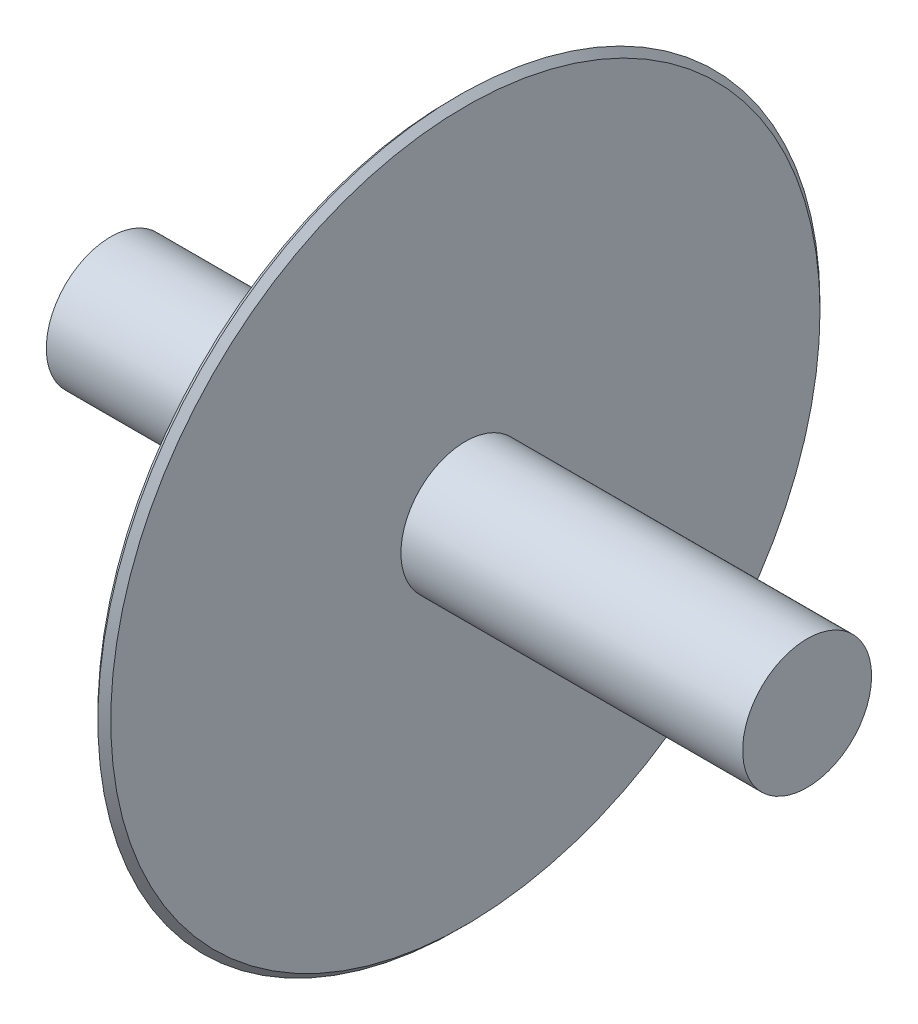
ISO-10303-21;
HEADER;
FILE_DESCRIPTION(('STEP AP214'),'2;1');
FILE_NAME('part.step','',(''),(''),'','','');
FILE_SCHEMA(('AUTOMOTIVE_DESIGN { 1 0 10303 214 1 1 1 1 }'));
ENDSEC;
DATA;
#1=APPLICATION_CONTEXT('core data for automotive mechanical design processes');
#2=APPLICATION_PROTOCOL_DEFINITION('international standard','automotive_design',2000,#1);
#3=PRODUCT_CONTEXT('',#1,'mechanical');
#4=PRODUCT('Part','Part','',(#3));
#5=PRODUCT_RELATED_PRODUCT_CATEGORY('part','',(#4));
#6=PRODUCT_DEFINITION_FORMATION('','',#4);
#7=PRODUCT_DEFINITION_CONTEXT('part definition',#1,'design');
#8=PRODUCT_DEFINITION('design','',#6,#7);
#9=PRODUCT_DEFINITION_SHAPE('','',#8);
#10=(LENGTH_UNIT() NAMED_UNIT(*) SI_UNIT(.MILLI.,.METRE.));
#11=(NAMED_UNIT(*) PLANE_ANGLE_UNIT() SI_UNIT($,.RADIAN.));
#12=(NAMED_UNIT(*) SI_UNIT($,.STERADIAN.) SOLID_ANGLE_UNIT());
#13=UNCERTAINTY_MEASURE_WITH_UNIT(LENGTH_MEASURE(1.E-05),#10,'distance_accuracy_value','');
#14=(GEOMETRIC_REPRESENTATION_CONTEXT(3) GLOBAL_UNCERTAINTY_ASSIGNED_CONTEXT((#13)) GLOBAL_UNIT_ASSIGNED_CONTEXT((#10,
#11,#12)) REPRESENTATION_CONTEXT('',''));
#15=CARTESIAN_POINT('',(0.,0.,0.));
#16=DIRECTION('',(0.,0.,1.));
#17=DIRECTION('',(1.,0.,0.));
#18=AXIS2_PLACEMENT_3D('',#15,#16,#17);
#19=CARTESIAN_POINT('',(13.5,0.,0.));
#20=DIRECTION('',(-1.,0.,0.));
#21=DIRECTION('',(0.,0.,1.));
#22=AXIS2_PLACEMENT_3D('',#19,#20,#21);
#23=CYLINDRICAL_SURFACE('',#22,2.5);
#24=CARTESIAN_POINT('',(0.25,0.,0.));
#25=DIRECTION('',(1.,0.,0.));
#26=DIRECTION('',(0.,0.,-1.));
#27=AXIS2_PLACEMENT_3D('',#24,#25,#26);
#28=CIRCLE('',#27,2.5);
#29=CARTESIAN_POINT('',(0.25,0.,-2.5));
#30=VERTEX_POINT('',#29);
#31=EDGE_CURVE('E50',#30,#30,#28,.T.);
#32=ORIENTED_EDGE('',*,*,#31,.T.);
#33=EDGE_LOOP('',(#32));
#34=FACE_BOUND('',#33,.T.);
#35=CARTESIAN_POINT('',(13.5,0.,0.));
#36=DIRECTION('',(1.,0.,0.));
#37=DIRECTION('',(0.,0.,-1.));
#38=AXIS2_PLACEMENT_3D('',#35,#36,#37);
#39=CIRCLE('',#38,2.5);
#40=CARTESIAN_POINT('',(13.5,0.,-2.5));
#41=VERTEX_POINT('',#40);
#42=EDGE_CURVE('E56',#41,#41,#39,.T.);
#43=ORIENTED_EDGE('',*,*,#42,.F.);
#44=EDGE_LOOP('',(#43));
#45=FACE_BOUND('',#44,.T.);
#46=ADVANCED_FACE('F34',(#34,#45),#23,.T.);
#47=CARTESIAN_POINT('',(13.5,0.,0.));
#48=DIRECTION('',(1.,0.,0.));
#49=DIRECTION('',(0.,0.,-1.));
#50=AXIS2_PLACEMENT_3D('',#47,#48,#49);
#51=PLANE('',#50);
#52=ORIENTED_EDGE('',*,*,#42,.T.);
#53=EDGE_LOOP('',(#52));
#54=FACE_BOUND('',#53,.T.);
#55=ADVANCED_FACE('F62',(#54),#51,.T.);
#56=CARTESIAN_POINT('',(0.25,0.,0.));
#57=DIRECTION('',(1.,0.,0.));
#58=DIRECTION('',(0.,0.,-1.));
#59=AXIS2_PLACEMENT_3D('',#56,#57,#58);
#60=PLANE('',#59);
#61=CARTESIAN_POINT('',(0.25,0.,0.));
#62=DIRECTION('',(1.,0.,0.));
#63=DIRECTION('',(0.,0.,-1.));
#64=AXIS2_PLACEMENT_3D('',#61,#62,#63);
#65=CIRCLE('',#64,13.75);
#66=CARTESIAN_POINT('',(0.25,0.,-13.75));
#67=VERTEX_POINT('',#66);
#68=EDGE_CURVE('E10',#67,#67,#65,.T.);
#69=ORIENTED_EDGE('',*,*,#68,.T.);
#70=EDGE_LOOP('',(#69));
#71=FACE_BOUND('',#70,.T.);
#72=ORIENTED_EDGE('',*,*,#31,.F.);
#73=EDGE_LOOP('',(#72));
#74=FACE_BOUND('',#73,.T.);
#75=ADVANCED_FACE('F71',(#71,#74),#60,.T.);
#76=CARTESIAN_POINT('',(-0.25,0.,0.));
#77=DIRECTION('',(1.,0.,0.));
#78=DIRECTION('',(0.,0.,-1.));
#79=AXIS2_PLACEMENT_3D('',#76,#77,#78);
#80=PLANE('',#79);
#81=CARTESIAN_POINT('',(-0.25,0.,0.));
#82=DIRECTION('',(1.,0.,0.));
#83=DIRECTION('',(0.,0.,-1.));
#84=AXIS2_PLACEMENT_3D('',#81,#82,#83);
#85=CIRCLE('',#84,13.75);
#86=CARTESIAN_POINT('',(-0.25,0.,-13.75));
#87=VERTEX_POINT('',#86);
#88=EDGE_CURVE('E43',#87,#87,#85,.F.);
#89=ORIENTED_EDGE('',*,*,#88,.T.);
#90=EDGE_LOOP('',(#89));
#91=FACE_BOUND('',#90,.T.);
#92=CARTESIAN_POINT('',(-0.25,0.,0.));
#93=DIRECTION('',(1.,0.,0.));
#94=DIRECTION('',(0.,0.,-1.));
#95=AXIS2_PLACEMENT_3D('',#92,#93,#94);
#96=CIRCLE('',#95,2.5);
#97=CARTESIAN_POINT('',(-0.25,0.,-2.5));
#98=VERTEX_POINT('',#97);
#99=EDGE_CURVE('E47',#98,#98,#96,.T.);
#100=ORIENTED_EDGE('',*,*,#99,.T.);
#101=EDGE_LOOP('',(#100));
#102=FACE_BOUND('',#101,.T.);
#103=ADVANCED_FACE('F83',(#91,#102),#80,.F.);
#104=CARTESIAN_POINT('',(-13.5,0.,0.));
#105=DIRECTION('',(1.,0.,0.));
#106=DIRECTION('',(0.,0.,-1.));
#107=AXIS2_PLACEMENT_3D('',#104,#105,#106);
#108=PLANE('',#107);
#109=CARTESIAN_POINT('',(-13.5,0.,0.));
#110=DIRECTION('',(1.,0.,0.));
#111=DIRECTION('',(0.,0.,-1.));
#112=AXIS2_PLACEMENT_3D('',#109,#110,#111);
#113=CIRCLE('',#112,2.5);
#114=CARTESIAN_POINT('',(-13.5,0.,-2.5));
#115=VERTEX_POINT('',#114);
#116=EDGE_CURVE('E53',#115,#115,#113,.T.);
#117=ORIENTED_EDGE('',*,*,#116,.F.);
#118=EDGE_LOOP('',(#117));
#119=FACE_BOUND('',#118,.T.);
#120=ADVANCED_FACE('F75',(#119),#108,.F.);
#121=ORIENTED_EDGE('',*,*,#116,.T.);
#122=EDGE_LOOP('',(#121));
#123=FACE_BOUND('',#122,.T.);
#124=ORIENTED_EDGE('',*,*,#99,.F.);
#125=EDGE_LOOP('',(#124));
#126=FACE_BOUND('',#125,.T.);
#127=ADVANCED_FACE('F67',(#123,#126),#23,.T.);
#128=CARTESIAN_POINT('',(0.25,0.,0.));
#129=DIRECTION('',(-1.,0.,0.));
#130=DIRECTION('',(0.,0.,1.));
#131=AXIS2_PLACEMENT_3D('',#128,#129,#130);
#132=CONICAL_SURFACE('',#131,13.75,0.785398163397438);
#133=ORIENTED_EDGE('',*,*,#68,.F.);
#134=EDGE_LOOP('',(#133));
#135=FACE_BOUND('',#134,.T.);
#136=CARTESIAN_POINT('',(0.,0.,0.));
#137=DIRECTION('',(1.,0.,0.));
#138=DIRECTION('',(0.,0.,-1.));
#139=AXIS2_PLACEMENT_3D('',#136,#137,#138);
#140=CIRCLE('',#139,14.);
#141=CARTESIAN_POINT('',(0.,0.,-14.));
#142=VERTEX_POINT('',#141);
#143=EDGE_CURVE('E39',#142,#142,#140,.F.);
#144=ORIENTED_EDGE('',*,*,#143,.F.);
#145=EDGE_LOOP('',(#144));
#146=FACE_BOUND('',#145,.T.);
#147=ADVANCED_FACE('F37',(#135,#146),#132,.T.);
#148=CARTESIAN_POINT('',(0.,0.,0.));
#149=DIRECTION('',(1.,0.,0.));
#150=DIRECTION('',(0.,0.,-1.));
#151=AXIS2_PLACEMENT_3D('',#148,#149,#150);
#152=CONICAL_SURFACE('',#151,14.,0.785398163397448);
#153=ORIENTED_EDGE('',*,*,#88,.F.);
#154=EDGE_LOOP('',(#153));
#155=FACE_BOUND('',#154,.T.);
#156=ORIENTED_EDGE('',*,*,#143,.T.);
#157=EDGE_LOOP('',(#156));
#158=FACE_BOUND('',#157,.T.);
#159=ADVANCED_FACE('F81',(#155,#158),#152,.T.);
#160=CLOSED_SHELL('',(#46,#55,#75,#103,#120,#127,#147,#159));
#161=MANIFOLD_SOLID_BREP('B2',#160);
#162=ADVANCED_BREP_SHAPE_REPRESENTATION('',(#18,#161),#14);
#163=SHAPE_DEFINITION_REPRESENTATION(#9,#162);
ENDSEC;
END-ISO-10303-21;
